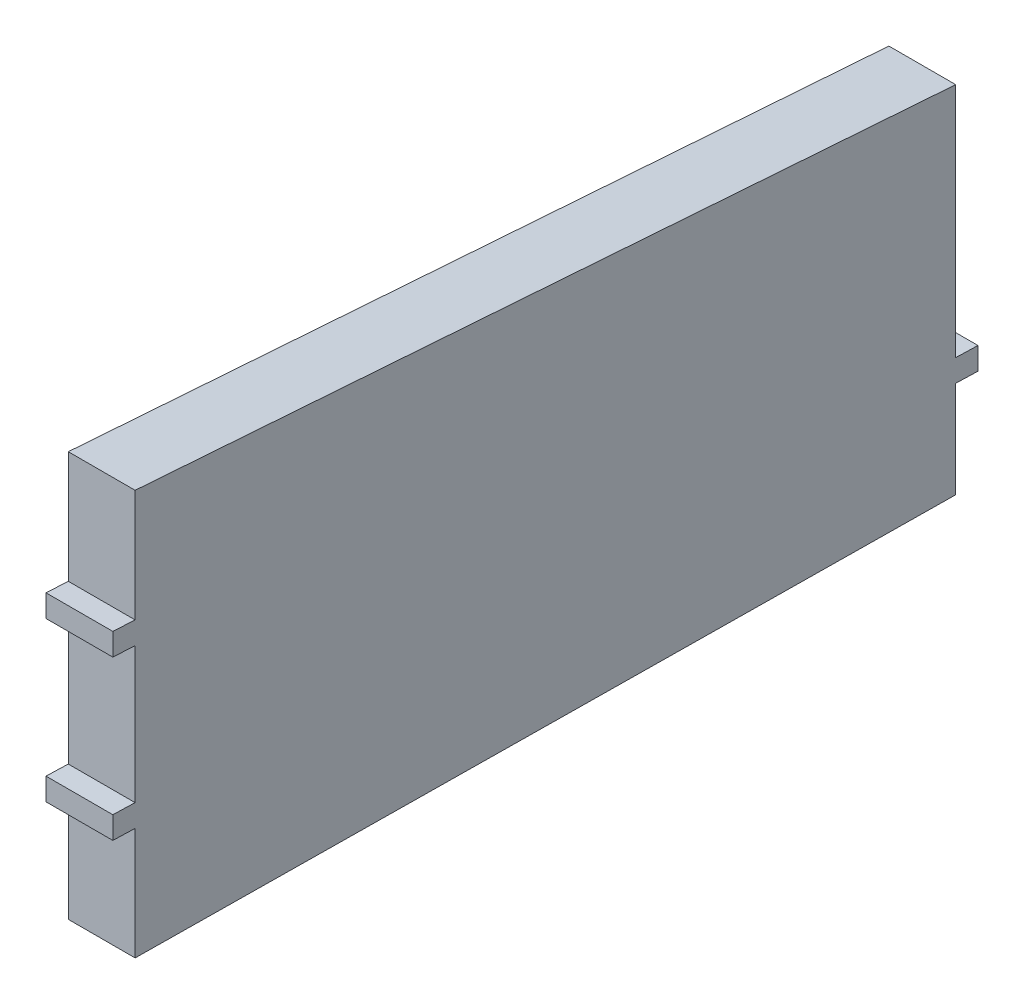
ISO-10303-21;
HEADER;
FILE_DESCRIPTION(('STEP AP214'),'2;1');
FILE_NAME('part.step','',(''),(''),'','','');
FILE_SCHEMA(('AUTOMOTIVE_DESIGN { 1 0 10303 214 1 1 1 1 }'));
ENDSEC;
DATA;
#1=APPLICATION_CONTEXT('core data for automotive mechanical design processes');
#2=APPLICATION_PROTOCOL_DEFINITION('international standard','automotive_design',2000,#1);
#3=PRODUCT_CONTEXT('',#1,'mechanical');
#4=PRODUCT('Part','Part','',(#3));
#5=PRODUCT_RELATED_PRODUCT_CATEGORY('part','',(#4));
#6=PRODUCT_DEFINITION_FORMATION('','',#4);
#7=PRODUCT_DEFINITION_CONTEXT('part definition',#1,'design');
#8=PRODUCT_DEFINITION('design','',#6,#7);
#9=PRODUCT_DEFINITION_SHAPE('','',#8);
#10=(LENGTH_UNIT() NAMED_UNIT(*) SI_UNIT(.MILLI.,.METRE.));
#11=(NAMED_UNIT(*) PLANE_ANGLE_UNIT() SI_UNIT($,.RADIAN.));
#12=(NAMED_UNIT(*) SI_UNIT($,.STERADIAN.) SOLID_ANGLE_UNIT());
#13=UNCERTAINTY_MEASURE_WITH_UNIT(LENGTH_MEASURE(1.E-05),#10,'distance_accuracy_value','');
#14=(GEOMETRIC_REPRESENTATION_CONTEXT(3) GLOBAL_UNCERTAINTY_ASSIGNED_CONTEXT((#13)) GLOBAL_UNIT_ASSIGNED_CONTEXT((#10,
#11,#12)) REPRESENTATION_CONTEXT('',''));
#15=CARTESIAN_POINT('',(0.,0.,0.));
#16=DIRECTION('',(0.,0.,1.));
#17=DIRECTION('',(1.,0.,0.));
#18=AXIS2_PLACEMENT_3D('',#15,#16,#17);
#19=CARTESIAN_POINT('',(243.017706630704,0.,0.));
#20=DIRECTION('',(-1.,0.,0.));
#21=DIRECTION('',(0.,0.,-1.));
#22=AXIS2_PLACEMENT_3D('',#19,#20,#21);
#23=PLANE('',#22);
#24=DIRECTION('',(0.,1.,0.));
#25=VECTOR('',#24,1.);
#26=CARTESIAN_POINT('',(243.017706630704,403.58668461406,-780.05619407791));
#27=LINE('',#26,#25);
#28=CARTESIAN_POINT('',(243.017706630704,403.58668461406,-780.05619407791));
#29=VERTEX_POINT('',#28);
#30=CARTESIAN_POINT('',(243.017706630704,419.582233202834,-780.05619407791));
#31=VERTEX_POINT('',#30);
#32=EDGE_CURVE('E152',#29,#31,#27,.T.);
#33=ORIENTED_EDGE('',*,*,#32,.T.);
#34=DIRECTION('',(0.,-0.0717092650488425,-0.997425576825737));
#35=VECTOR('',#34,1.);
#36=CARTESIAN_POINT('',(243.017706630704,419.582233202834,-780.05619407791));
#37=LINE('',#36,#35);
#38=CARTESIAN_POINT('',(243.017706630704,411.174488344699,-897.002027495908));
#39=VERTEX_POINT('',#38);
#40=EDGE_CURVE('E155',#31,#39,#37,.T.);
#41=ORIENTED_EDGE('',*,*,#40,.T.);
#42=DIRECTION('',(0.,-1.,0.));
#43=VECTOR('',#42,1.);
#44=CARTESIAN_POINT('',(243.017706630704,394.238773631358,-897.002027495908));
#45=LINE('',#44,#43);
#46=CARTESIAN_POINT('',(243.017706630704,377.489748380192,-897.002027495908));
#47=VERTEX_POINT('',#46);
#48=EDGE_CURVE('E160',#39,#47,#45,.T.);
#49=ORIENTED_EDGE('',*,*,#48,.T.);
#50=DIRECTION('',(0.,-0.0302886855912008,-0.999541192510423));
#51=VECTOR('',#50,1.);
#52=CARTESIAN_POINT('',(243.017706630704,377.489748380192,-897.002027495908));
#53=LINE('',#52,#51);
#54=CARTESIAN_POINT('',(243.017706630704,377.393537661241,-900.177027495908));
#55=VERTEX_POINT('',#54);
#56=EDGE_CURVE('E170',#47,#55,#53,.T.);
#57=ORIENTED_EDGE('',*,*,#56,.T.);
#58=DIRECTION('',(0.,-1.,0.));
#59=VECTOR('',#58,1.);
#60=CARTESIAN_POINT('',(243.017706630704,377.393537661241,-900.177027495908));
#61=LINE('',#60,#59);
#62=CARTESIAN_POINT('',(243.017706630704,374.218537661241,-900.177027495908));
#63=VERTEX_POINT('',#62);
#64=EDGE_CURVE('E173',#55,#63,#61,.T.);
#65=ORIENTED_EDGE('',*,*,#64,.T.);
#66=DIRECTION('',(0.,0.0302886855911833,0.999541192510423));
#67=VECTOR('',#66,1.);
#68=CARTESIAN_POINT('',(243.017706630704,374.218537661241,-900.177027495908));
#69=LINE('',#68,#67);
#70=CARTESIAN_POINT('',(243.017706630704,374.314748380192,-897.002027495908));
#71=VERTEX_POINT('',#70);
#72=EDGE_CURVE('E176',#63,#71,#69,.T.);
#73=ORIENTED_EDGE('',*,*,#72,.T.);
#74=DIRECTION('',(0.,-1.,0.));
#75=VECTOR('',#74,1.);
#76=CARTESIAN_POINT('',(243.017706630704,374.314748380192,-897.002027495908));
#77=LINE('',#76,#75);
#78=CARTESIAN_POINT('',(243.017706630704,360.55403366685,-897.002027495908));
#79=VERTEX_POINT('',#78);
#80=EDGE_CURVE('E179',#71,#79,#77,.T.);
#81=ORIENTED_EDGE('',*,*,#80,.T.);
#82=DIRECTION('',(0.,0.0111918961809718,0.999937368768602));
#83=VECTOR('',#82,1.);
#84=CARTESIAN_POINT('',(243.017706630704,360.55403366685,-897.002027495908));
#85=LINE('',#84,#83);
#86=CARTESIAN_POINT('',(243.017706630704,361.86296127301,-780.05619407791));
#87=VERTEX_POINT('',#86);
#88=EDGE_CURVE('E182',#79,#87,#85,.T.);
#89=ORIENTED_EDGE('',*,*,#88,.T.);
#90=DIRECTION('',(0.,1.,0.));
#91=VECTOR('',#90,1.);
#92=CARTESIAN_POINT('',(243.017706630704,361.86296127301,-780.05619407791));
#93=LINE('',#92,#91);
#94=CARTESIAN_POINT('',(243.017706630704,377.858509861784,-780.05619407791));
#95=VERTEX_POINT('',#94);
#96=EDGE_CURVE('E185',#87,#95,#93,.T.);
#97=ORIENTED_EDGE('',*,*,#96,.T.);
#98=DIRECTION('',(0.,0.0302886855912008,0.999541192510423));
#99=VECTOR('',#98,1.);
#100=CARTESIAN_POINT('',(243.017706630704,377.858509861784,-780.05619407791));
#101=LINE('',#100,#99);
#102=CARTESIAN_POINT('',(243.017706630704,377.954720580734,-776.88119407791));
#103=VERTEX_POINT('',#102);
#104=EDGE_CURVE('E188',#95,#103,#101,.T.);
#105=ORIENTED_EDGE('',*,*,#104,.T.);
#106=DIRECTION('',(0.,1.,0.));
#107=VECTOR('',#106,1.);
#108=CARTESIAN_POINT('',(243.017706630704,377.954720580734,-776.88119407791));
#109=LINE('',#108,#107);
#110=CARTESIAN_POINT('',(243.017706630704,381.129720580734,-776.88119407791));
#111=VERTEX_POINT('',#110);
#112=EDGE_CURVE('E191',#103,#111,#109,.T.);
#113=ORIENTED_EDGE('',*,*,#112,.T.);
#114=DIRECTION('',(0.,-0.0302886855912008,-0.999541192510423));
#115=VECTOR('',#114,1.);
#116=CARTESIAN_POINT('',(243.017706630704,381.129720580734,-776.88119407791));
#117=LINE('',#116,#115);
#118=CARTESIAN_POINT('',(243.017706630704,381.033509861784,-780.05619407791));
#119=VERTEX_POINT('',#118);
#120=EDGE_CURVE('E194',#111,#119,#117,.T.);
#121=ORIENTED_EDGE('',*,*,#120,.T.);
#122=DIRECTION('',(0.,1.,0.));
#123=VECTOR('',#122,1.);
#124=CARTESIAN_POINT('',(243.017706630704,381.033509861784,-780.05619407791));
#125=LINE('',#124,#123);
#126=CARTESIAN_POINT('',(243.017706630704,400.41168461406,-780.05619407791));
#127=VERTEX_POINT('',#126);
#128=EDGE_CURVE('E197',#119,#127,#125,.T.);
#129=ORIENTED_EDGE('',*,*,#128,.T.);
#130=DIRECTION('',(0.,0.0527109798388512,0.998609809988079));
#131=VECTOR('',#130,1.);
#132=CARTESIAN_POINT('',(243.017706630704,400.41168461406,-780.05619407791));
#133=LINE('',#132,#131);
#134=CARTESIAN_POINT('',(243.017706630704,400.57927495747,-776.88119407791));
#135=VERTEX_POINT('',#134);
#136=EDGE_CURVE('E200',#127,#135,#133,.T.);
#137=ORIENTED_EDGE('',*,*,#136,.T.);
#138=DIRECTION('',(0.,1.,0.));
#139=VECTOR('',#138,1.);
#140=CARTESIAN_POINT('',(243.017706630704,400.57927495747,-776.88119407791));
#141=LINE('',#140,#139);
#142=CARTESIAN_POINT('',(243.017706630704,403.75427495747,-776.88119407791));
#143=VERTEX_POINT('',#142);
#144=EDGE_CURVE('E203',#135,#143,#141,.T.);
#145=ORIENTED_EDGE('',*,*,#144,.T.);
#146=DIRECTION('',(0.,-0.0527109798388512,-0.998609809988079));
#147=VECTOR('',#146,1.);
#148=CARTESIAN_POINT('',(243.017706630704,403.75427495747,-776.88119407791));
#149=LINE('',#148,#147);
#150=EDGE_CURVE('E165',#143,#29,#149,.T.);
#151=ORIENTED_EDGE('',*,*,#150,.T.);
#152=EDGE_LOOP('',(#33,#41,#49,#57,#65,#73,#81,#89,#97,#105,#113,#121,#129,#137,#145,#151));
#153=FACE_BOUND('',#152,.T.);
#154=ADVANCED_FACE('F35',(#153),#23,.T.);
#155=CARTESIAN_POINT('',(389.24014946962,403.75427495747,-776.88119407791));
#156=DIRECTION('',(0.,-0.998609809988079,0.0527109798388512));
#157=DIRECTION('',(0.,0.0527109798388512,0.99860980998808));
#158=AXIS2_PLACEMENT_3D('',#155,#156,#157);
#159=PLANE('',#158);
#160=DIRECTION('',(-1.,0.,0.));
#161=VECTOR('',#160,1.);
#162=CARTESIAN_POINT('',(389.24014946962,403.58668461406,-780.05619407791));
#163=LINE('',#162,#161);
#164=CARTESIAN_POINT('',(252.542706630704,403.58668461406,-780.05619407791));
#165=VERTEX_POINT('',#164);
#166=EDGE_CURVE('E206',#165,#29,#163,.T.);
#167=ORIENTED_EDGE('',*,*,#166,.T.);
#168=ORIENTED_EDGE('',*,*,#150,.F.);
#169=DIRECTION('',(-1.,0.,0.));
#170=VECTOR('',#169,1.);
#171=CARTESIAN_POINT('',(389.24014946962,403.75427495747,-776.88119407791));
#172=LINE('',#171,#170);
#173=CARTESIAN_POINT('',(252.542706630704,403.75427495747,-776.88119407791));
#174=VERTEX_POINT('',#173);
#175=EDGE_CURVE('E208',#174,#143,#172,.T.);
#176=ORIENTED_EDGE('',*,*,#175,.F.);
#177=DIRECTION('',(0.,0.0527109798388512,0.99860980998808));
#178=VECTOR('',#177,1.);
#179=CARTESIAN_POINT('',(252.542706630704,403.75427495747,-776.88119407791));
#180=LINE('',#179,#178);
#181=EDGE_CURVE('E39',#165,#174,#180,.T.);
#182=ORIENTED_EDGE('',*,*,#181,.F.);
#183=EDGE_LOOP('',(#167,#168,#176,#182));
#184=FACE_BOUND('',#183,.T.);
#185=ADVANCED_FACE('F306',(#184),#159,.F.);
#186=CARTESIAN_POINT('',(389.24014946962,400.57927495747,-776.88119407791));
#187=DIRECTION('',(0.,0.,-1.));
#188=DIRECTION('',(1.,0.,0.));
#189=AXIS2_PLACEMENT_3D('',#186,#187,#188);
#190=PLANE('',#189);
#191=ORIENTED_EDGE('',*,*,#175,.T.);
#192=ORIENTED_EDGE('',*,*,#144,.F.);
#193=DIRECTION('',(-1.,0.,0.));
#194=VECTOR('',#193,1.);
#195=CARTESIAN_POINT('',(389.24014946962,400.57927495747,-776.88119407791));
#196=LINE('',#195,#194);
#197=CARTESIAN_POINT('',(252.542706630704,400.57927495747,-776.88119407791));
#198=VERTEX_POINT('',#197);
#199=EDGE_CURVE('E210',#198,#135,#196,.T.);
#200=ORIENTED_EDGE('',*,*,#199,.F.);
#201=DIRECTION('',(0.,-1.,0.));
#202=VECTOR('',#201,1.);
#203=CARTESIAN_POINT('',(252.542706630704,400.57927495747,-776.88119407791));
#204=LINE('',#203,#202);
#205=EDGE_CURVE('E302',#174,#198,#204,.T.);
#206=ORIENTED_EDGE('',*,*,#205,.F.);
#207=EDGE_LOOP('',(#191,#192,#200,#206));
#208=FACE_BOUND('',#207,.T.);
#209=ADVANCED_FACE('F300',(#208),#190,.F.);
#210=CARTESIAN_POINT('',(389.24014946962,400.41168461406,-780.05619407791));
#211=DIRECTION('',(0.,0.998609809988079,-0.0527109798388512));
#212=DIRECTION('',(0.,-0.0527109798388512,-0.99860980998808));
#213=AXIS2_PLACEMENT_3D('',#210,#211,#212);
#214=PLANE('',#213);
#215=ORIENTED_EDGE('',*,*,#199,.T.);
#216=ORIENTED_EDGE('',*,*,#136,.F.);
#217=DIRECTION('',(-1.,0.,0.));
#218=VECTOR('',#217,1.);
#219=CARTESIAN_POINT('',(389.24014946962,400.41168461406,-780.05619407791));
#220=LINE('',#219,#218);
#221=CARTESIAN_POINT('',(252.542706630704,400.41168461406,-780.05619407791));
#222=VERTEX_POINT('',#221);
#223=EDGE_CURVE('E212',#222,#127,#220,.T.);
#224=ORIENTED_EDGE('',*,*,#223,.F.);
#225=DIRECTION('',(0.,-0.0527109798388512,-0.99860980998808));
#226=VECTOR('',#225,1.);
#227=CARTESIAN_POINT('',(252.542706630704,400.41168461406,-780.05619407791));
#228=LINE('',#227,#226);
#229=EDGE_CURVE('E297',#198,#222,#228,.T.);
#230=ORIENTED_EDGE('',*,*,#229,.F.);
#231=EDGE_LOOP('',(#215,#216,#224,#230));
#232=FACE_BOUND('',#231,.T.);
#233=ADVANCED_FACE('F294',(#232),#214,.F.);
#234=CARTESIAN_POINT('',(389.24014946962,381.033509861784,-780.05619407791));
#235=DIRECTION('',(0.,0.,-1.));
#236=DIRECTION('',(0.,-1.,0.));
#237=AXIS2_PLACEMENT_3D('',#234,#235,#236);
#238=PLANE('',#237);
#239=ORIENTED_EDGE('',*,*,#223,.T.);
#240=ORIENTED_EDGE('',*,*,#128,.F.);
#241=DIRECTION('',(-1.,0.,0.));
#242=VECTOR('',#241,1.);
#243=CARTESIAN_POINT('',(389.24014946962,381.033509861784,-780.05619407791));
#244=LINE('',#243,#242);
#245=CARTESIAN_POINT('',(252.542706630704,381.033509861784,-780.05619407791));
#246=VERTEX_POINT('',#245);
#247=EDGE_CURVE('E214',#246,#119,#244,.T.);
#248=ORIENTED_EDGE('',*,*,#247,.F.);
#249=DIRECTION('',(0.,-1.,0.));
#250=VECTOR('',#249,1.);
#251=CARTESIAN_POINT('',(252.542706630704,381.033509861784,-780.05619407791));
#252=LINE('',#251,#250);
#253=EDGE_CURVE('E309',#222,#246,#252,.T.);
#254=ORIENTED_EDGE('',*,*,#253,.F.);
#255=EDGE_LOOP('',(#239,#240,#248,#254));
#256=FACE_BOUND('',#255,.T.);
#257=ADVANCED_FACE('F289',(#256),#238,.F.);
#258=CARTESIAN_POINT('',(389.24014946962,381.129720580734,-776.88119407791));
#259=DIRECTION('',(0.,-0.999541192510423,0.0302886855912008));
#260=DIRECTION('',(0.,0.0302886855912008,0.999541192510423));
#261=AXIS2_PLACEMENT_3D('',#258,#259,#260);
#262=PLANE('',#261);
#263=ORIENTED_EDGE('',*,*,#247,.T.);
#264=ORIENTED_EDGE('',*,*,#120,.F.);
#265=DIRECTION('',(-1.,0.,0.));
#266=VECTOR('',#265,1.);
#267=CARTESIAN_POINT('',(389.24014946962,381.129720580734,-776.88119407791));
#268=LINE('',#267,#266);
#269=CARTESIAN_POINT('',(252.542706630704,381.129720580734,-776.88119407791));
#270=VERTEX_POINT('',#269);
#271=EDGE_CURVE('E216',#270,#111,#268,.T.);
#272=ORIENTED_EDGE('',*,*,#271,.F.);
#273=DIRECTION('',(0.,0.0302886855912008,0.999541192510423));
#274=VECTOR('',#273,1.);
#275=CARTESIAN_POINT('',(252.542706630704,381.129720580734,-776.88119407791));
#276=LINE('',#275,#274);
#277=EDGE_CURVE('E286',#246,#270,#276,.T.);
#278=ORIENTED_EDGE('',*,*,#277,.F.);
#279=EDGE_LOOP('',(#263,#264,#272,#278));
#280=FACE_BOUND('',#279,.T.);
#281=ADVANCED_FACE('F283',(#280),#262,.F.);
#282=CARTESIAN_POINT('',(389.24014946962,377.954720580734,-776.88119407791));
#283=DIRECTION('',(0.,0.,-1.));
#284=DIRECTION('',(1.,0.,0.));
#285=AXIS2_PLACEMENT_3D('',#282,#283,#284);
#286=PLANE('',#285);
#287=ORIENTED_EDGE('',*,*,#271,.T.);
#288=ORIENTED_EDGE('',*,*,#112,.F.);
#289=DIRECTION('',(-1.,0.,0.));
#290=VECTOR('',#289,1.);
#291=CARTESIAN_POINT('',(389.24014946962,377.954720580734,-776.88119407791));
#292=LINE('',#291,#290);
#293=CARTESIAN_POINT('',(252.542706630704,377.954720580734,-776.88119407791));
#294=VERTEX_POINT('',#293);
#295=EDGE_CURVE('E218',#294,#103,#292,.T.);
#296=ORIENTED_EDGE('',*,*,#295,.F.);
#297=DIRECTION('',(0.,-1.,0.));
#298=VECTOR('',#297,1.);
#299=CARTESIAN_POINT('',(252.542706630704,377.954720580734,-776.88119407791));
#300=LINE('',#299,#298);
#301=EDGE_CURVE('E280',#270,#294,#300,.T.);
#302=ORIENTED_EDGE('',*,*,#301,.F.);
#303=EDGE_LOOP('',(#287,#288,#296,#302));
#304=FACE_BOUND('',#303,.T.);
#305=ADVANCED_FACE('F277',(#304),#286,.F.);
#306=CARTESIAN_POINT('',(389.24014946962,377.858509861784,-780.05619407791));
#307=DIRECTION('',(0.,0.999541192510423,-0.0302886855912008));
#308=DIRECTION('',(0.,-0.0302886855912008,-0.999541192510423));
#309=AXIS2_PLACEMENT_3D('',#306,#307,#308);
#310=PLANE('',#309);
#311=ORIENTED_EDGE('',*,*,#295,.T.);
#312=ORIENTED_EDGE('',*,*,#104,.F.);
#313=DIRECTION('',(-1.,0.,0.));
#314=VECTOR('',#313,1.);
#315=CARTESIAN_POINT('',(389.24014946962,377.858509861784,-780.05619407791));
#316=LINE('',#315,#314);
#317=CARTESIAN_POINT('',(252.542706630704,377.858509861784,-780.05619407791));
#318=VERTEX_POINT('',#317);
#319=EDGE_CURVE('E220',#318,#95,#316,.T.);
#320=ORIENTED_EDGE('',*,*,#319,.F.);
#321=DIRECTION('',(0.,-0.0302886855912008,-0.999541192510423));
#322=VECTOR('',#321,1.);
#323=CARTESIAN_POINT('',(252.542706630704,377.858509861784,-780.05619407791));
#324=LINE('',#323,#322);
#325=EDGE_CURVE('E315',#294,#318,#324,.T.);
#326=ORIENTED_EDGE('',*,*,#325,.F.);
#327=EDGE_LOOP('',(#311,#312,#320,#326));
#328=FACE_BOUND('',#327,.T.);
#329=ADVANCED_FACE('F272',(#328),#310,.F.);
#330=CARTESIAN_POINT('',(389.24014946962,361.86296127301,-780.05619407791));
#331=DIRECTION('',(0.,0.,-1.));
#332=DIRECTION('',(0.,-1.,0.));
#333=AXIS2_PLACEMENT_3D('',#330,#331,#332);
#334=PLANE('',#333);
#335=ORIENTED_EDGE('',*,*,#319,.T.);
#336=ORIENTED_EDGE('',*,*,#96,.F.);
#337=DIRECTION('',(-1.,0.,0.));
#338=VECTOR('',#337,1.);
#339=CARTESIAN_POINT('',(389.24014946962,361.86296127301,-780.05619407791));
#340=LINE('',#339,#338);
#341=CARTESIAN_POINT('',(252.542706630704,361.86296127301,-780.05619407791));
#342=VERTEX_POINT('',#341);
#343=EDGE_CURVE('E222',#342,#87,#340,.T.);
#344=ORIENTED_EDGE('',*,*,#343,.F.);
#345=DIRECTION('',(0.,-1.,0.));
#346=VECTOR('',#345,1.);
#347=CARTESIAN_POINT('',(252.542706630704,361.86296127301,-780.05619407791));
#348=LINE('',#347,#346);
#349=EDGE_CURVE('E269',#318,#342,#348,.T.);
#350=ORIENTED_EDGE('',*,*,#349,.F.);
#351=EDGE_LOOP('',(#335,#336,#344,#350));
#352=FACE_BOUND('',#351,.T.);
#353=ADVANCED_FACE('F266',(#352),#334,.F.);
#354=CARTESIAN_POINT('',(389.24014946962,360.55403366685,-897.002027495908));
#355=DIRECTION('',(0.,0.999937368768602,-0.0111918961809718));
#356=DIRECTION('',(0.,-0.0111918961809718,-0.999937368768602));
#357=AXIS2_PLACEMENT_3D('',#354,#355,#356);
#358=PLANE('',#357);
#359=ORIENTED_EDGE('',*,*,#343,.T.);
#360=ORIENTED_EDGE('',*,*,#88,.F.);
#361=DIRECTION('',(-1.,0.,0.));
#362=VECTOR('',#361,1.);
#363=CARTESIAN_POINT('',(389.24014946962,360.55403366685,-897.002027495908));
#364=LINE('',#363,#362);
#365=CARTESIAN_POINT('',(252.542706630704,360.55403366685,-897.002027495908));
#366=VERTEX_POINT('',#365);
#367=EDGE_CURVE('E224',#366,#79,#364,.T.);
#368=ORIENTED_EDGE('',*,*,#367,.F.);
#369=DIRECTION('',(0.,-0.0111918961809718,-0.999937368768602));
#370=VECTOR('',#369,1.);
#371=CARTESIAN_POINT('',(252.542706630704,360.55403366685,-897.002027495908));
#372=LINE('',#371,#370);
#373=EDGE_CURVE('E263',#342,#366,#372,.T.);
#374=ORIENTED_EDGE('',*,*,#373,.F.);
#375=EDGE_LOOP('',(#359,#360,#368,#374));
#376=FACE_BOUND('',#375,.T.);
#377=ADVANCED_FACE('F260',(#376),#358,.F.);
#378=CARTESIAN_POINT('',(389.24014946962,374.314748380192,-897.002027495908));
#379=DIRECTION('',(0.,0.,1.));
#380=DIRECTION('',(-1.,0.,0.));
#381=AXIS2_PLACEMENT_3D('',#378,#379,#380);
#382=PLANE('',#381);
#383=ORIENTED_EDGE('',*,*,#367,.T.);
#384=ORIENTED_EDGE('',*,*,#80,.F.);
#385=DIRECTION('',(-1.,0.,0.));
#386=VECTOR('',#385,1.);
#387=CARTESIAN_POINT('',(389.24014946962,374.314748380192,-897.002027495908));
#388=LINE('',#387,#386);
#389=CARTESIAN_POINT('',(252.542706630704,374.314748380192,-897.002027495908));
#390=VERTEX_POINT('',#389);
#391=EDGE_CURVE('E226',#390,#71,#388,.T.);
#392=ORIENTED_EDGE('',*,*,#391,.F.);
#393=DIRECTION('',(0.,1.,0.));
#394=VECTOR('',#393,1.);
#395=CARTESIAN_POINT('',(252.542706630704,374.314748380192,-897.002027495908));
#396=LINE('',#395,#394);
#397=EDGE_CURVE('E319',#366,#390,#396,.T.);
#398=ORIENTED_EDGE('',*,*,#397,.F.);
#399=EDGE_LOOP('',(#383,#384,#392,#398));
#400=FACE_BOUND('',#399,.T.);
#401=ADVANCED_FACE('F255',(#400),#382,.F.);
#402=CARTESIAN_POINT('',(389.24014946962,374.218537661241,-900.177027495908));
#403=DIRECTION('',(0.,0.999541192510423,-0.0302886855911833));
#404=DIRECTION('',(0.,-0.0302886855911833,-0.999541192510423));
#405=AXIS2_PLACEMENT_3D('',#402,#403,#404);
#406=PLANE('',#405);
#407=ORIENTED_EDGE('',*,*,#391,.T.);
#408=ORIENTED_EDGE('',*,*,#72,.F.);
#409=DIRECTION('',(-1.,0.,0.));
#410=VECTOR('',#409,1.);
#411=CARTESIAN_POINT('',(389.24014946962,374.218537661241,-900.177027495908));
#412=LINE('',#411,#410);
#413=CARTESIAN_POINT('',(252.542706630704,374.218537661241,-900.177027495908));
#414=VERTEX_POINT('',#413);
#415=EDGE_CURVE('E228',#414,#63,#412,.T.);
#416=ORIENTED_EDGE('',*,*,#415,.F.);
#417=DIRECTION('',(0.,-0.0302886855911833,-0.999541192510423));
#418=VECTOR('',#417,1.);
#419=CARTESIAN_POINT('',(252.542706630704,374.218537661241,-900.177027495908));
#420=LINE('',#419,#418);
#421=EDGE_CURVE('E252',#390,#414,#420,.T.);
#422=ORIENTED_EDGE('',*,*,#421,.F.);
#423=EDGE_LOOP('',(#407,#408,#416,#422));
#424=FACE_BOUND('',#423,.T.);
#425=ADVANCED_FACE('F249',(#424),#406,.F.);
#426=CARTESIAN_POINT('',(389.24014946962,377.393537661241,-900.177027495908));
#427=DIRECTION('',(0.,0.,1.));
#428=DIRECTION('',(-1.,0.,0.));
#429=AXIS2_PLACEMENT_3D('',#426,#427,#428);
#430=PLANE('',#429);
#431=ORIENTED_EDGE('',*,*,#415,.T.);
#432=ORIENTED_EDGE('',*,*,#64,.F.);
#433=DIRECTION('',(-1.,0.,0.));
#434=VECTOR('',#433,1.);
#435=CARTESIAN_POINT('',(389.24014946962,377.393537661241,-900.177027495908));
#436=LINE('',#435,#434);
#437=CARTESIAN_POINT('',(252.542706630704,377.393537661241,-900.177027495908));
#438=VERTEX_POINT('',#437);
#439=EDGE_CURVE('E230',#438,#55,#436,.T.);
#440=ORIENTED_EDGE('',*,*,#439,.F.);
#441=DIRECTION('',(0.,1.,0.));
#442=VECTOR('',#441,1.);
#443=CARTESIAN_POINT('',(252.542706630704,377.393537661241,-900.177027495908));
#444=LINE('',#443,#442);
#445=EDGE_CURVE('E246',#414,#438,#444,.T.);
#446=ORIENTED_EDGE('',*,*,#445,.F.);
#447=EDGE_LOOP('',(#431,#432,#440,#446));
#448=FACE_BOUND('',#447,.T.);
#449=ADVANCED_FACE('F243',(#448),#430,.F.);
#450=CARTESIAN_POINT('',(389.24014946962,377.489748380192,-897.002027495908));
#451=DIRECTION('',(0.,-0.999541192510423,0.0302886855912008));
#452=DIRECTION('',(0.,0.0302886855912008,0.999541192510423));
#453=AXIS2_PLACEMENT_3D('',#450,#451,#452);
#454=PLANE('',#453);
#455=ORIENTED_EDGE('',*,*,#439,.T.);
#456=ORIENTED_EDGE('',*,*,#56,.F.);
#457=DIRECTION('',(-1.,0.,0.));
#458=VECTOR('',#457,1.);
#459=CARTESIAN_POINT('',(389.24014946962,377.489748380192,-897.002027495908));
#460=LINE('',#459,#458);
#461=CARTESIAN_POINT('',(252.542706630704,377.489748380192,-897.002027495908));
#462=VERTEX_POINT('',#461);
#463=EDGE_CURVE('E232',#462,#47,#460,.T.);
#464=ORIENTED_EDGE('',*,*,#463,.F.);
#465=DIRECTION('',(0.,0.0302886855912008,0.999541192510423));
#466=VECTOR('',#465,1.);
#467=CARTESIAN_POINT('',(252.542706630704,377.489748380192,-897.002027495908));
#468=LINE('',#467,#466);
#469=EDGE_CURVE('E323',#438,#462,#468,.T.);
#470=ORIENTED_EDGE('',*,*,#469,.F.);
#471=EDGE_LOOP('',(#455,#456,#464,#470));
#472=FACE_BOUND('',#471,.T.);
#473=ADVANCED_FACE('F238',(#472),#454,.F.);
#474=CARTESIAN_POINT('',(389.24014946962,394.238773631358,-897.002027495908));
#475=DIRECTION('',(0.,0.,1.));
#476=DIRECTION('',(-1.,0.,0.));
#477=AXIS2_PLACEMENT_3D('',#474,#475,#476);
#478=PLANE('',#477);
#479=ORIENTED_EDGE('',*,*,#463,.T.);
#480=ORIENTED_EDGE('',*,*,#48,.F.);
#481=DIRECTION('',(-1.,0.,0.));
#482=VECTOR('',#481,1.);
#483=CARTESIAN_POINT('',(389.24014946962,411.174488344699,-897.002027495908));
#484=LINE('',#483,#482);
#485=CARTESIAN_POINT('',(252.542706630704,411.174488344699,-897.002027495908));
#486=VERTEX_POINT('',#485);
#487=EDGE_CURVE('E153',#486,#39,#484,.T.);
#488=ORIENTED_EDGE('',*,*,#487,.F.);
#489=DIRECTION('',(0.,1.,0.));
#490=VECTOR('',#489,1.);
#491=CARTESIAN_POINT('',(252.542706630704,394.238773631358,-897.002027495908));
#492=LINE('',#491,#490);
#493=EDGE_CURVE('E58',#462,#486,#492,.T.);
#494=ORIENTED_EDGE('',*,*,#493,.F.);
#495=EDGE_LOOP('',(#479,#480,#488,#494));
#496=FACE_BOUND('',#495,.T.);
#497=ADVANCED_FACE('F236',(#496),#478,.F.);
#498=CARTESIAN_POINT('',(389.24014946962,419.582233202834,-780.05619407791));
#499=DIRECTION('',(0.,-0.997425576825737,0.0717092650488425));
#500=DIRECTION('',(0.,0.0717092650488425,0.997425576825738));
#501=AXIS2_PLACEMENT_3D('',#498,#499,#500);
#502=PLANE('',#501);
#503=ORIENTED_EDGE('',*,*,#487,.T.);
#504=ORIENTED_EDGE('',*,*,#40,.F.);
#505=DIRECTION('',(-1.,0.,0.));
#506=VECTOR('',#505,1.);
#507=CARTESIAN_POINT('',(389.24014946962,419.582233202834,-780.05619407791));
#508=LINE('',#507,#506);
#509=CARTESIAN_POINT('',(252.542706630704,419.582233202834,-780.05619407791));
#510=VERTEX_POINT('',#509);
#511=EDGE_CURVE('E148',#510,#31,#508,.T.);
#512=ORIENTED_EDGE('',*,*,#511,.F.);
#513=DIRECTION('',(0.,0.0717092650488425,0.997425576825737));
#514=VECTOR('',#513,1.);
#515=CARTESIAN_POINT('',(252.542706630704,419.582233202834,-780.05619407791));
#516=LINE('',#515,#514);
#517=EDGE_CURVE('E44',#486,#510,#516,.T.);
#518=ORIENTED_EDGE('',*,*,#517,.F.);
#519=EDGE_LOOP('',(#503,#504,#512,#518));
#520=FACE_BOUND('',#519,.T.);
#521=ADVANCED_FACE('F156',(#520),#502,.F.);
#522=CARTESIAN_POINT('',(389.24014946962,403.58668461406,-780.05619407791));
#523=DIRECTION('',(0.,0.,-1.));
#524=DIRECTION('',(1.,0.,0.));
#525=AXIS2_PLACEMENT_3D('',#522,#523,#524);
#526=PLANE('',#525);
#527=ORIENTED_EDGE('',*,*,#511,.T.);
#528=ORIENTED_EDGE('',*,*,#32,.F.);
#529=ORIENTED_EDGE('',*,*,#166,.F.);
#530=DIRECTION('',(0.,-1.,0.));
#531=VECTOR('',#530,1.);
#532=CARTESIAN_POINT('',(252.542706630704,403.58668461406,-780.05619407791));
#533=LINE('',#532,#531);
#534=EDGE_CURVE('E11',#510,#165,#533,.T.);
#535=ORIENTED_EDGE('',*,*,#534,.F.);
#536=EDGE_LOOP('',(#527,#528,#529,#535));
#537=FACE_BOUND('',#536,.T.);
#538=ADVANCED_FACE('F37',(#537),#526,.F.);
#539=CARTESIAN_POINT('',(252.542706630704,344.834338896103,-776.88119407791));
#540=DIRECTION('',(-1.,0.,0.));
#541=DIRECTION('',(0.,0.,-1.));
#542=AXIS2_PLACEMENT_3D('',#539,#540,#541);
#543=PLANE('',#542);
#544=ORIENTED_EDGE('',*,*,#517,.T.);
#545=ORIENTED_EDGE('',*,*,#534,.T.);
#546=ORIENTED_EDGE('',*,*,#181,.T.);
#547=ORIENTED_EDGE('',*,*,#205,.T.);
#548=ORIENTED_EDGE('',*,*,#229,.T.);
#549=ORIENTED_EDGE('',*,*,#253,.T.);
#550=ORIENTED_EDGE('',*,*,#277,.T.);
#551=ORIENTED_EDGE('',*,*,#301,.T.);
#552=ORIENTED_EDGE('',*,*,#325,.T.);
#553=ORIENTED_EDGE('',*,*,#349,.T.);
#554=ORIENTED_EDGE('',*,*,#373,.T.);
#555=ORIENTED_EDGE('',*,*,#397,.T.);
#556=ORIENTED_EDGE('',*,*,#421,.T.);
#557=ORIENTED_EDGE('',*,*,#445,.T.);
#558=ORIENTED_EDGE('',*,*,#469,.T.);
#559=ORIENTED_EDGE('',*,*,#493,.T.);
#560=EDGE_LOOP('',(#544,#545,#546,#547,#548,#549,#550,#551,#552,#553,#554,#555,#556,#557,#558,#559));
#561=FACE_BOUND('',#560,.T.);
#562=ADVANCED_FACE('F325',(#561),#543,.F.);
#563=CLOSED_SHELL('',(#154,#185,#209,#233,#257,#281,#305,#329,#353,#377,#401,#425,#449,#473,
#497,#521,#538,#562));
#564=MANIFOLD_SOLID_BREP('B2',#563);
#565=ADVANCED_BREP_SHAPE_REPRESENTATION('',(#18,#564),#14);
#566=SHAPE_DEFINITION_REPRESENTATION(#9,#565);
ENDSEC;
END-ISO-10303-21;
